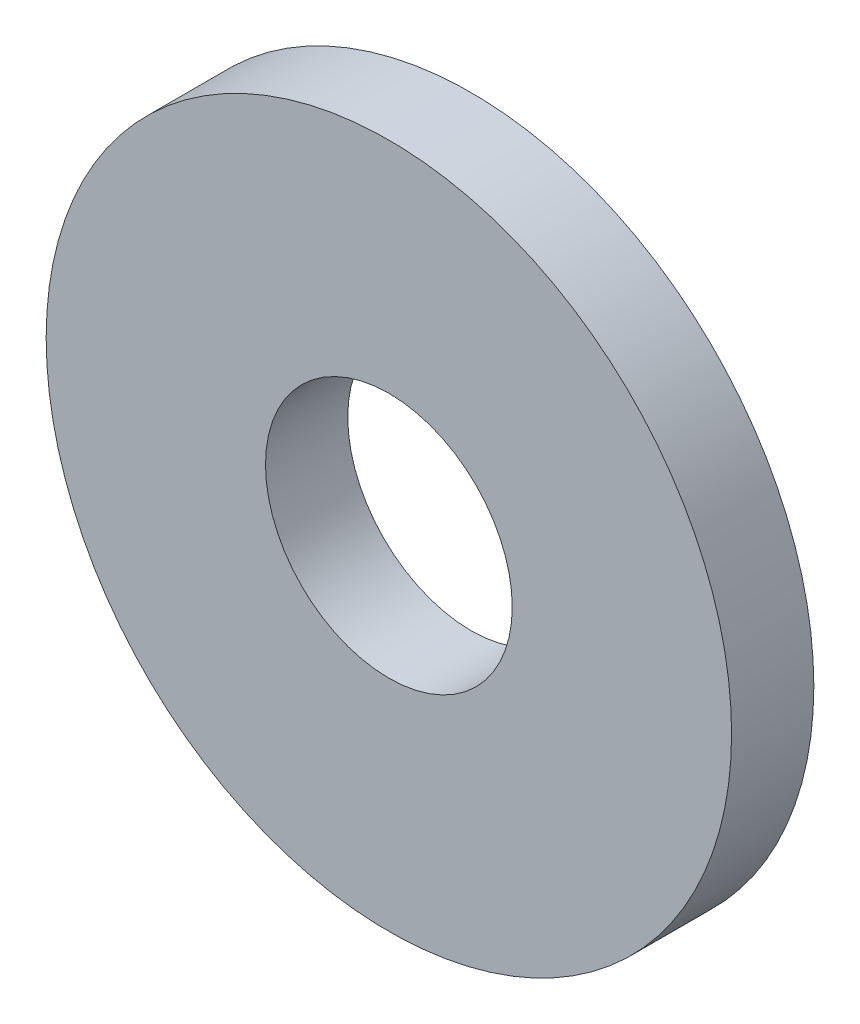
ISO-10303-21;
HEADER;
FILE_DESCRIPTION(('STEP AP214'),'2;1');
FILE_NAME('part.step','',(''),(''),'','','');
FILE_SCHEMA(('AUTOMOTIVE_DESIGN { 1 0 10303 214 1 1 1 1 }'));
ENDSEC;
DATA;
#1=APPLICATION_CONTEXT('core data for automotive mechanical design processes');
#2=APPLICATION_PROTOCOL_DEFINITION('international standard','automotive_design',2000,#1);
#3=PRODUCT_CONTEXT('',#1,'mechanical');
#4=PRODUCT('Part','Part','',(#3));
#5=PRODUCT_RELATED_PRODUCT_CATEGORY('part','',(#4));
#6=PRODUCT_DEFINITION_FORMATION('','',#4);
#7=PRODUCT_DEFINITION_CONTEXT('part definition',#1,'design');
#8=PRODUCT_DEFINITION('design','',#6,#7);
#9=PRODUCT_DEFINITION_SHAPE('','',#8);
#10=(LENGTH_UNIT() NAMED_UNIT(*) SI_UNIT(.MILLI.,.METRE.));
#11=(NAMED_UNIT(*) PLANE_ANGLE_UNIT() SI_UNIT($,.RADIAN.));
#12=(NAMED_UNIT(*) SI_UNIT($,.STERADIAN.) SOLID_ANGLE_UNIT());
#13=UNCERTAINTY_MEASURE_WITH_UNIT(LENGTH_MEASURE(1.E-05),#10,'distance_accuracy_value','');
#14=(GEOMETRIC_REPRESENTATION_CONTEXT(3) GLOBAL_UNCERTAINTY_ASSIGNED_CONTEXT((#13)) GLOBAL_UNIT_ASSIGNED_CONTEXT((#10,
#11,#12)) REPRESENTATION_CONTEXT('',''));
#15=CARTESIAN_POINT('',(0.,0.,0.));
#16=DIRECTION('',(0.,0.,1.));
#17=DIRECTION('',(1.,0.,0.));
#18=AXIS2_PLACEMENT_3D('',#15,#16,#17);
#19=CARTESIAN_POINT('',(0.,0.,1.2));
#20=DIRECTION('',(0.,0.,1.));
#21=DIRECTION('',(1.,0.,0.));
#22=AXIS2_PLACEMENT_3D('',#19,#20,#21);
#23=PLANE('',#22);
#24=CARTESIAN_POINT('',(0.,0.,1.2));
#25=DIRECTION('',(0.,0.,1.));
#26=DIRECTION('',(1.,0.,0.));
#27=AXIS2_PLACEMENT_3D('',#24,#25,#26);
#28=CIRCLE('',#27,5.);
#29=CARTESIAN_POINT('',(5.,0.,1.2));
#30=VERTEX_POINT('',#29);
#31=EDGE_CURVE('E10',#30,#30,#28,.T.);
#32=ORIENTED_EDGE('',*,*,#31,.T.);
#33=EDGE_LOOP('',(#32));
#34=FACE_BOUND('',#33,.T.);
#35=CARTESIAN_POINT('',(0.,0.,1.2));
#36=DIRECTION('',(0.,0.,1.));
#37=DIRECTION('',(1.,0.,0.));
#38=AXIS2_PLACEMENT_3D('',#35,#36,#37);
#39=CIRCLE('',#38,1.8);
#40=CARTESIAN_POINT('',(1.8,0.,1.2));
#41=VERTEX_POINT('',#40);
#42=EDGE_CURVE('E45',#41,#41,#39,.T.);
#43=ORIENTED_EDGE('',*,*,#42,.F.);
#44=EDGE_LOOP('',(#43));
#45=FACE_BOUND('',#44,.T.);
#46=ADVANCED_FACE('F34',(#34,#45),#23,.T.);
#47=CARTESIAN_POINT('',(0.,0.,0.));
#48=DIRECTION('',(0.,0.,1.));
#49=DIRECTION('',(1.,0.,0.));
#50=AXIS2_PLACEMENT_3D('',#47,#48,#49);
#51=PLANE('',#50);
#52=CARTESIAN_POINT('',(0.,0.,0.));
#53=DIRECTION('',(0.,0.,1.));
#54=DIRECTION('',(1.,0.,0.));
#55=AXIS2_PLACEMENT_3D('',#52,#53,#54);
#56=CIRCLE('',#55,5.);
#57=CARTESIAN_POINT('',(5.,0.,0.));
#58=VERTEX_POINT('',#57);
#59=EDGE_CURVE('E38',#58,#58,#56,.T.);
#60=ORIENTED_EDGE('',*,*,#59,.F.);
#61=EDGE_LOOP('',(#60));
#62=FACE_BOUND('',#61,.T.);
#63=CARTESIAN_POINT('',(0.,0.,0.));
#64=DIRECTION('',(0.,0.,1.));
#65=DIRECTION('',(1.,0.,0.));
#66=AXIS2_PLACEMENT_3D('',#63,#64,#65);
#67=CIRCLE('',#66,1.8);
#68=CARTESIAN_POINT('',(1.8,0.,0.));
#69=VERTEX_POINT('',#68);
#70=EDGE_CURVE('E47',#69,#69,#67,.T.);
#71=ORIENTED_EDGE('',*,*,#70,.T.);
#72=EDGE_LOOP('',(#71));
#73=FACE_BOUND('',#72,.T.);
#74=ADVANCED_FACE('F57',(#62,#73),#51,.F.);
#75=CARTESIAN_POINT('',(0.,0.,1.2));
#76=DIRECTION('',(0.,0.,-1.));
#77=DIRECTION('',(-1.,0.,0.));
#78=AXIS2_PLACEMENT_3D('',#75,#76,#77);
#79=CYLINDRICAL_SURFACE('',#78,5.);
#80=ORIENTED_EDGE('',*,*,#31,.F.);
#81=EDGE_LOOP('',(#80));
#82=FACE_BOUND('',#81,.T.);
#83=ORIENTED_EDGE('',*,*,#59,.T.);
#84=EDGE_LOOP('',(#83));
#85=FACE_BOUND('',#84,.T.);
#86=ADVANCED_FACE('F36',(#82,#85),#79,.T.);
#87=CARTESIAN_POINT('',(0.,0.,1.2));
#88=DIRECTION('',(0.,0.,-1.));
#89=DIRECTION('',(-1.,0.,0.));
#90=AXIS2_PLACEMENT_3D('',#87,#88,#89);
#91=CYLINDRICAL_SURFACE('',#90,1.8);
#92=ORIENTED_EDGE('',*,*,#42,.T.);
#93=EDGE_LOOP('',(#92));
#94=FACE_BOUND('',#93,.T.);
#95=ORIENTED_EDGE('',*,*,#70,.F.);
#96=EDGE_LOOP('',(#95));
#97=FACE_BOUND('',#96,.T.);
#98=ADVANCED_FACE('F53',(#94,#97),#91,.F.);
#99=CLOSED_SHELL('',(#46,#74,#86,#98));
#100=MANIFOLD_SOLID_BREP('B2',#99);
#101=ADVANCED_BREP_SHAPE_REPRESENTATION('',(#18,#100),#14);
#102=SHAPE_DEFINITION_REPRESENTATION(#9,#101);
ENDSEC;
END-ISO-10303-21;
